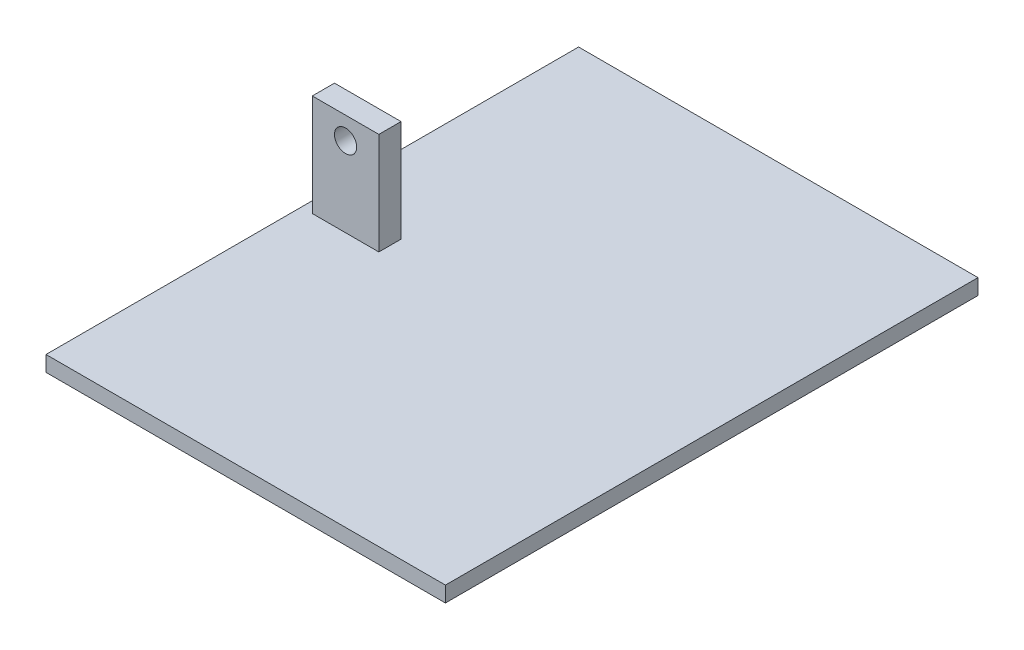
ISO-10303-21;
HEADER;
FILE_DESCRIPTION(('STEP AP214'),'2;1');
FILE_NAME('part.step','',(''),(''),'','','');
FILE_SCHEMA(('AUTOMOTIVE_DESIGN { 1 0 10303 214 1 1 1 1 }'));
ENDSEC;
DATA;
#1=APPLICATION_CONTEXT('core data for automotive mechanical design processes');
#2=APPLICATION_PROTOCOL_DEFINITION('international standard','automotive_design',2000,#1);
#3=PRODUCT_CONTEXT('',#1,'mechanical');
#4=PRODUCT('Part','Part','',(#3));
#5=PRODUCT_RELATED_PRODUCT_CATEGORY('part','',(#4));
#6=PRODUCT_DEFINITION_FORMATION('','',#4);
#7=PRODUCT_DEFINITION_CONTEXT('part definition',#1,'design');
#8=PRODUCT_DEFINITION('design','',#6,#7);
#9=PRODUCT_DEFINITION_SHAPE('','',#8);
#10=(LENGTH_UNIT() NAMED_UNIT(*) SI_UNIT(.MILLI.,.METRE.));
#11=(NAMED_UNIT(*) PLANE_ANGLE_UNIT() SI_UNIT($,.RADIAN.));
#12=(NAMED_UNIT(*) SI_UNIT($,.STERADIAN.) SOLID_ANGLE_UNIT());
#13=UNCERTAINTY_MEASURE_WITH_UNIT(LENGTH_MEASURE(1.E-05),#10,'distance_accuracy_value','');
#14=(GEOMETRIC_REPRESENTATION_CONTEXT(3) GLOBAL_UNCERTAINTY_ASSIGNED_CONTEXT((#13)) GLOBAL_UNIT_ASSIGNED_CONTEXT((#10,
#11,#12)) REPRESENTATION_CONTEXT('',''));
#15=CARTESIAN_POINT('',(0.,0.,0.));
#16=DIRECTION('',(0.,0.,1.));
#17=DIRECTION('',(1.,0.,0.));
#18=AXIS2_PLACEMENT_3D('',#15,#16,#17);
#19=CARTESIAN_POINT('',(0.,0.,0.));
#20=DIRECTION('',(0.,1.,0.));
#21=DIRECTION('',(0.,0.,1.));
#22=AXIS2_PLACEMENT_3D('',#19,#20,#21);
#23=PLANE('',#22);
#24=DIRECTION('',(0.,0.,-1.));
#25=VECTOR('',#24,1.);
#26=CARTESIAN_POINT('',(228.6,0.,-304.8));
#27=LINE('',#26,#25);
#28=CARTESIAN_POINT('',(228.6,0.,304.8));
#29=VERTEX_POINT('',#28);
#30=CARTESIAN_POINT('',(228.6,0.,-304.8));
#31=VERTEX_POINT('',#30);
#32=EDGE_CURVE('E134',#29,#31,#27,.T.);
#33=ORIENTED_EDGE('',*,*,#32,.T.);
#34=DIRECTION('',(-1.,0.,0.));
#35=VECTOR('',#34,1.);
#36=CARTESIAN_POINT('',(-228.6,0.,-304.8));
#37=LINE('',#36,#35);
#38=CARTESIAN_POINT('',(-228.6,0.,-304.8));
#39=VERTEX_POINT('',#38);
#40=EDGE_CURVE('E137',#31,#39,#37,.T.);
#41=ORIENTED_EDGE('',*,*,#40,.T.);
#42=DIRECTION('',(0.,0.,1.));
#43=VECTOR('',#42,1.);
#44=CARTESIAN_POINT('',(-228.6,0.,-304.8));
#45=LINE('',#44,#43);
#46=CARTESIAN_POINT('',(-228.6,0.,304.8));
#47=VERTEX_POINT('',#46);
#48=EDGE_CURVE('E154',#39,#47,#45,.T.);
#49=ORIENTED_EDGE('',*,*,#48,.T.);
#50=DIRECTION('',(1.,0.,0.));
#51=VECTOR('',#50,1.);
#52=CARTESIAN_POINT('',(-228.6,0.,304.8));
#53=LINE('',#52,#51);
#54=EDGE_CURVE('E145',#47,#29,#53,.T.);
#55=ORIENTED_EDGE('',*,*,#54,.T.);
#56=EDGE_LOOP('',(#33,#41,#49,#55));
#57=FACE_BOUND('',#56,.T.);
#58=DIRECTION('',(0.,0.,1.));
#59=VECTOR('',#58,1.);
#60=CARTESIAN_POINT('',(-215.9,0.,-12.7));
#61=LINE('',#60,#59);
#62=CARTESIAN_POINT('',(-215.9,0.,-12.7));
#63=VERTEX_POINT('',#62);
#64=CARTESIAN_POINT('',(-215.9,0.,12.7));
#65=VERTEX_POINT('',#64);
#66=EDGE_CURVE('E269',#63,#65,#61,.T.);
#67=ORIENTED_EDGE('',*,*,#66,.F.);
#68=DIRECTION('',(-1.,0.,0.));
#69=VECTOR('',#68,1.);
#70=CARTESIAN_POINT('',(-139.7,0.,-12.7));
#71=LINE('',#70,#69);
#72=CARTESIAN_POINT('',(-139.7,0.,-12.7));
#73=VERTEX_POINT('',#72);
#74=EDGE_CURVE('E132',#73,#63,#71,.T.);
#75=ORIENTED_EDGE('',*,*,#74,.F.);
#76=DIRECTION('',(0.,0.,-1.));
#77=VECTOR('',#76,1.);
#78=CARTESIAN_POINT('',(-139.7,0.,12.7));
#79=LINE('',#78,#77);
#80=CARTESIAN_POINT('',(-139.7,0.,12.7));
#81=VERTEX_POINT('',#80);
#82=EDGE_CURVE('E128',#81,#73,#79,.T.);
#83=ORIENTED_EDGE('',*,*,#82,.F.);
#84=DIRECTION('',(1.,0.,0.));
#85=VECTOR('',#84,1.);
#86=CARTESIAN_POINT('',(-215.9,0.,12.7));
#87=LINE('',#86,#85);
#88=EDGE_CURVE('E276',#65,#81,#87,.T.);
#89=ORIENTED_EDGE('',*,*,#88,.F.);
#90=EDGE_LOOP('',(#67,#75,#83,#89));
#91=FACE_BOUND('',#90,.T.);
#92=ADVANCED_FACE('F35',(#57,#91),#23,.T.);
#93=CARTESIAN_POINT('',(228.6,-17.78,-304.8));
#94=DIRECTION('',(1.,0.,0.));
#95=DIRECTION('',(0.,0.,-1.));
#96=AXIS2_PLACEMENT_3D('',#93,#94,#95);
#97=PLANE('',#96);
#98=ORIENTED_EDGE('',*,*,#32,.F.);
#99=DIRECTION('',(0.,1.,0.));
#100=VECTOR('',#99,1.);
#101=CARTESIAN_POINT('',(228.6,-17.78,304.8));
#102=LINE('',#101,#100);
#103=CARTESIAN_POINT('',(228.6,-17.78,304.8));
#104=VERTEX_POINT('',#103);
#105=EDGE_CURVE('E11',#104,#29,#102,.T.);
#106=ORIENTED_EDGE('',*,*,#105,.F.);
#107=DIRECTION('',(0.,0.,-1.));
#108=VECTOR('',#107,1.);
#109=CARTESIAN_POINT('',(228.6,-17.78,-304.8));
#110=LINE('',#109,#108);
#111=CARTESIAN_POINT('',(228.6,-17.78,-304.8));
#112=VERTEX_POINT('',#111);
#113=EDGE_CURVE('E142',#104,#112,#110,.T.);
#114=ORIENTED_EDGE('',*,*,#113,.T.);
#115=DIRECTION('',(0.,1.,0.));
#116=VECTOR('',#115,1.);
#117=CARTESIAN_POINT('',(228.6,-17.78,-304.8));
#118=LINE('',#117,#116);
#119=EDGE_CURVE('E85',#112,#31,#118,.T.);
#120=ORIENTED_EDGE('',*,*,#119,.T.);
#121=EDGE_LOOP('',(#98,#106,#114,#120));
#122=FACE_BOUND('',#121,.T.);
#123=ADVANCED_FACE('F37',(#122),#97,.T.);
#124=CARTESIAN_POINT('',(-228.6,-17.78,304.8));
#125=DIRECTION('',(0.,0.,1.));
#126=DIRECTION('',(1.,0.,0.));
#127=AXIS2_PLACEMENT_3D('',#124,#125,#126);
#128=PLANE('',#127);
#129=ORIENTED_EDGE('',*,*,#54,.F.);
#130=DIRECTION('',(0.,1.,0.));
#131=VECTOR('',#130,1.);
#132=CARTESIAN_POINT('',(-228.6,-17.78,304.8));
#133=LINE('',#132,#131);
#134=CARTESIAN_POINT('',(-228.6,-17.78,304.8));
#135=VERTEX_POINT('',#134);
#136=EDGE_CURVE('E44',#135,#47,#133,.T.);
#137=ORIENTED_EDGE('',*,*,#136,.F.);
#138=DIRECTION('',(1.,0.,0.));
#139=VECTOR('',#138,1.);
#140=CARTESIAN_POINT('',(-228.6,-17.78,304.8));
#141=LINE('',#140,#139);
#142=EDGE_CURVE('E150',#135,#104,#141,.T.);
#143=ORIENTED_EDGE('',*,*,#142,.T.);
#144=ORIENTED_EDGE('',*,*,#105,.T.);
#145=EDGE_LOOP('',(#129,#137,#143,#144));
#146=FACE_BOUND('',#145,.T.);
#147=ADVANCED_FACE('F165',(#146),#128,.T.);
#148=CARTESIAN_POINT('',(-228.6,-17.78,-304.8));
#149=DIRECTION('',(-1.,0.,0.));
#150=DIRECTION('',(0.,0.,1.));
#151=AXIS2_PLACEMENT_3D('',#148,#149,#150);
#152=PLANE('',#151);
#153=ORIENTED_EDGE('',*,*,#48,.F.);
#154=DIRECTION('',(0.,1.,0.));
#155=VECTOR('',#154,1.);
#156=CARTESIAN_POINT('',(-228.6,-17.78,-304.8));
#157=LINE('',#156,#155);
#158=CARTESIAN_POINT('',(-228.6,-17.78,-304.8));
#159=VERTEX_POINT('',#158);
#160=EDGE_CURVE('E160',#159,#39,#157,.T.);
#161=ORIENTED_EDGE('',*,*,#160,.F.);
#162=DIRECTION('',(0.,0.,1.));
#163=VECTOR('',#162,1.);
#164=CARTESIAN_POINT('',(-228.6,-17.78,-304.8));
#165=LINE('',#164,#163);
#166=EDGE_CURVE('E147',#159,#135,#165,.T.);
#167=ORIENTED_EDGE('',*,*,#166,.T.);
#168=ORIENTED_EDGE('',*,*,#136,.T.);
#169=EDGE_LOOP('',(#153,#161,#167,#168));
#170=FACE_BOUND('',#169,.T.);
#171=ADVANCED_FACE('F169',(#170),#152,.T.);
#172=CARTESIAN_POINT('',(-228.6,-17.78,-304.8));
#173=DIRECTION('',(0.,0.,-1.));
#174=DIRECTION('',(-1.,0.,0.));
#175=AXIS2_PLACEMENT_3D('',#172,#173,#174);
#176=PLANE('',#175);
#177=ORIENTED_EDGE('',*,*,#40,.F.);
#178=ORIENTED_EDGE('',*,*,#119,.F.);
#179=DIRECTION('',(-1.,0.,0.));
#180=VECTOR('',#179,1.);
#181=CARTESIAN_POINT('',(-228.6,-17.78,-304.8));
#182=LINE('',#181,#180);
#183=EDGE_CURVE('E144',#112,#159,#182,.T.);
#184=ORIENTED_EDGE('',*,*,#183,.T.);
#185=ORIENTED_EDGE('',*,*,#160,.T.);
#186=EDGE_LOOP('',(#177,#178,#184,#185));
#187=FACE_BOUND('',#186,.T.);
#188=ADVANCED_FACE('F161',(#187),#176,.T.);
#189=CARTESIAN_POINT('',(0.,-17.78,0.));
#190=DIRECTION('',(0.,1.,0.));
#191=DIRECTION('',(0.,0.,1.));
#192=AXIS2_PLACEMENT_3D('',#189,#190,#191);
#193=PLANE('',#192);
#194=ORIENTED_EDGE('',*,*,#113,.F.);
#195=ORIENTED_EDGE('',*,*,#142,.F.);
#196=ORIENTED_EDGE('',*,*,#166,.F.);
#197=ORIENTED_EDGE('',*,*,#183,.F.);
#198=EDGE_LOOP('',(#194,#195,#196,#197));
#199=FACE_BOUND('',#198,.T.);
#200=ADVANCED_FACE('F171',(#199),#193,.F.);
#201=CARTESIAN_POINT('',(-139.7,116.586,-12.7));
#202=DIRECTION('',(0.,0.,1.));
#203=DIRECTION('',(1.,0.,0.));
#204=AXIS2_PLACEMENT_3D('',#201,#202,#203);
#205=PLANE('',#204);
#206=CARTESIAN_POINT('',(-177.8,91.186,-12.7));
#207=DIRECTION('',(0.,0.,1.));
#208=DIRECTION('',(1.,0.,0.));
#209=AXIS2_PLACEMENT_3D('',#206,#207,#208);
#210=CIRCLE('',#209,12.7);
#211=CARTESIAN_POINT('',(-165.1,91.186,-12.7));
#212=VERTEX_POINT('',#211);
#213=EDGE_CURVE('E267',#212,#212,#210,.F.);
#214=ORIENTED_EDGE('',*,*,#213,.F.);
#215=EDGE_LOOP('',(#214));
#216=FACE_BOUND('',#215,.T.);
#217=ORIENTED_EDGE('',*,*,#74,.T.);
#218=DIRECTION('',(0.,-1.,0.));
#219=VECTOR('',#218,1.);
#220=CARTESIAN_POINT('',(-215.9,116.586,-12.7));
#221=LINE('',#220,#219);
#222=CARTESIAN_POINT('',(-215.9,116.586,-12.7));
#223=VERTEX_POINT('',#222);
#224=EDGE_CURVE('E113',#223,#63,#221,.T.);
#225=ORIENTED_EDGE('',*,*,#224,.F.);
#226=DIRECTION('',(-1.,0.,0.));
#227=VECTOR('',#226,1.);
#228=CARTESIAN_POINT('',(-139.7,116.586,-12.7));
#229=LINE('',#228,#227);
#230=CARTESIAN_POINT('',(-139.7,116.586,-12.7));
#231=VERTEX_POINT('',#230);
#232=EDGE_CURVE('E120',#231,#223,#229,.T.);
#233=ORIENTED_EDGE('',*,*,#232,.F.);
#234=DIRECTION('',(0.,-1.,0.));
#235=VECTOR('',#234,1.);
#236=CARTESIAN_POINT('',(-139.7,116.586,-12.7));
#237=LINE('',#236,#235);
#238=EDGE_CURVE('E273',#231,#73,#237,.T.);
#239=ORIENTED_EDGE('',*,*,#238,.T.);
#240=EDGE_LOOP('',(#217,#225,#233,#239));
#241=FACE_BOUND('',#240,.T.);
#242=ADVANCED_FACE('F130',(#216,#241),#205,.F.);
#243=CARTESIAN_POINT('',(-215.9,116.586,-12.7));
#244=DIRECTION('',(1.,0.,0.));
#245=DIRECTION('',(0.,0.,-1.));
#246=AXIS2_PLACEMENT_3D('',#243,#244,#245);
#247=PLANE('',#246);
#248=ORIENTED_EDGE('',*,*,#66,.T.);
#249=DIRECTION('',(0.,-1.,0.));
#250=VECTOR('',#249,1.);
#251=CARTESIAN_POINT('',(-215.9,116.586,12.7));
#252=LINE('',#251,#250);
#253=CARTESIAN_POINT('',(-215.9,116.586,12.7));
#254=VERTEX_POINT('',#253);
#255=EDGE_CURVE('E116',#254,#65,#252,.T.);
#256=ORIENTED_EDGE('',*,*,#255,.F.);
#257=DIRECTION('',(0.,0.,1.));
#258=VECTOR('',#257,1.);
#259=CARTESIAN_POINT('',(-215.9,116.586,-12.7));
#260=LINE('',#259,#258);
#261=EDGE_CURVE('E109',#223,#254,#260,.T.);
#262=ORIENTED_EDGE('',*,*,#261,.F.);
#263=ORIENTED_EDGE('',*,*,#224,.T.);
#264=EDGE_LOOP('',(#248,#256,#262,#263));
#265=FACE_BOUND('',#264,.T.);
#266=ADVANCED_FACE('F111',(#265),#247,.F.);
#267=CARTESIAN_POINT('',(-215.9,116.586,12.7));
#268=DIRECTION('',(0.,0.,-1.));
#269=DIRECTION('',(-1.,0.,0.));
#270=AXIS2_PLACEMENT_3D('',#267,#268,#269);
#271=PLANE('',#270);
#272=CARTESIAN_POINT('',(-177.8,91.186,12.7));
#273=DIRECTION('',(0.,0.,-1.));
#274=DIRECTION('',(-1.,0.,0.));
#275=AXIS2_PLACEMENT_3D('',#272,#273,#274);
#276=CIRCLE('',#275,12.7);
#277=CARTESIAN_POINT('',(-190.5,91.186,12.7));
#278=VERTEX_POINT('',#277);
#279=EDGE_CURVE('E39',#278,#278,#276,.F.);
#280=ORIENTED_EDGE('',*,*,#279,.F.);
#281=EDGE_LOOP('',(#280));
#282=FACE_BOUND('',#281,.T.);
#283=ORIENTED_EDGE('',*,*,#88,.T.);
#284=DIRECTION('',(0.,-1.,0.));
#285=VECTOR('',#284,1.);
#286=CARTESIAN_POINT('',(-139.7,116.586,12.7));
#287=LINE('',#286,#285);
#288=CARTESIAN_POINT('',(-139.7,116.586,12.7));
#289=VERTEX_POINT('',#288);
#290=EDGE_CURVE('E52',#289,#81,#287,.T.);
#291=ORIENTED_EDGE('',*,*,#290,.F.);
#292=DIRECTION('',(1.,0.,0.));
#293=VECTOR('',#292,1.);
#294=CARTESIAN_POINT('',(-215.9,116.586,12.7));
#295=LINE('',#294,#293);
#296=EDGE_CURVE('E119',#254,#289,#295,.T.);
#297=ORIENTED_EDGE('',*,*,#296,.F.);
#298=ORIENTED_EDGE('',*,*,#255,.T.);
#299=EDGE_LOOP('',(#283,#291,#297,#298));
#300=FACE_BOUND('',#299,.T.);
#301=ADVANCED_FACE('F218',(#282,#300),#271,.F.);
#302=CARTESIAN_POINT('',(-139.7,116.586,12.7));
#303=DIRECTION('',(-1.,0.,0.));
#304=DIRECTION('',(0.,0.,1.));
#305=AXIS2_PLACEMENT_3D('',#302,#303,#304);
#306=PLANE('',#305);
#307=ORIENTED_EDGE('',*,*,#82,.T.);
#308=ORIENTED_EDGE('',*,*,#238,.F.);
#309=DIRECTION('',(0.,0.,-1.));
#310=VECTOR('',#309,1.);
#311=CARTESIAN_POINT('',(-139.7,116.586,12.7));
#312=LINE('',#311,#310);
#313=EDGE_CURVE('E124',#289,#231,#312,.T.);
#314=ORIENTED_EDGE('',*,*,#313,.F.);
#315=ORIENTED_EDGE('',*,*,#290,.T.);
#316=EDGE_LOOP('',(#307,#308,#314,#315));
#317=FACE_BOUND('',#316,.T.);
#318=ADVANCED_FACE('F226',(#317),#306,.F.);
#319=CARTESIAN_POINT('',(0.,116.586,0.));
#320=DIRECTION('',(0.,1.,0.));
#321=DIRECTION('',(0.,0.,1.));
#322=AXIS2_PLACEMENT_3D('',#319,#320,#321);
#323=PLANE('',#322);
#324=ORIENTED_EDGE('',*,*,#232,.T.);
#325=ORIENTED_EDGE('',*,*,#261,.T.);
#326=ORIENTED_EDGE('',*,*,#296,.T.);
#327=ORIENTED_EDGE('',*,*,#313,.T.);
#328=EDGE_LOOP('',(#324,#325,#326,#327));
#329=FACE_BOUND('',#328,.T.);
#330=ADVANCED_FACE('F123',(#329),#323,.T.);
#331=CARTESIAN_POINT('',(-177.8,91.186,254.));
#332=DIRECTION('',(0.,0.,-1.));
#333=DIRECTION('',(-1.,0.,0.));
#334=AXIS2_PLACEMENT_3D('',#331,#332,#333);
#335=CYLINDRICAL_SURFACE('',#334,12.7);
#336=ORIENTED_EDGE('',*,*,#279,.T.);
#337=EDGE_LOOP('',(#336));
#338=FACE_BOUND('',#337,.T.);
#339=ORIENTED_EDGE('',*,*,#213,.T.);
#340=EDGE_LOOP('',(#339));
#341=FACE_BOUND('',#340,.T.);
#342=ADVANCED_FACE('F238',(#338,#341),#335,.F.);
#343=CLOSED_SHELL('',(#92,#123,#147,#171,#188,#200,#242,#266,#301,#318,#330,#342));
#344=MANIFOLD_SOLID_BREP('B2',#343);
#345=ADVANCED_BREP_SHAPE_REPRESENTATION('',(#18,#344),#14);
#346=SHAPE_DEFINITION_REPRESENTATION(#9,#345);
ENDSEC;
END-ISO-10303-21;
